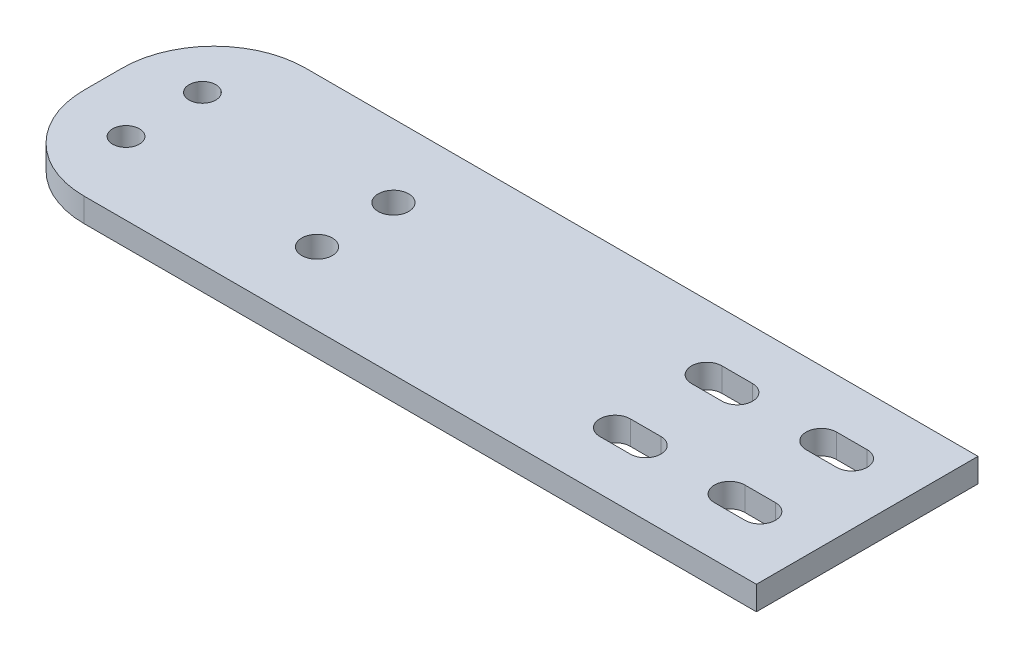
ISO-10303-21;
HEADER;
FILE_DESCRIPTION(('STEP AP214'),'2;1');
FILE_NAME('part.step','',(''),(''),'','','');
FILE_SCHEMA(('AUTOMOTIVE_DESIGN { 1 0 10303 214 1 1 1 1 }'));
ENDSEC;
DATA;
#1=APPLICATION_CONTEXT('core data for automotive mechanical design processes');
#2=APPLICATION_PROTOCOL_DEFINITION('international standard','automotive_design',2000,#1);
#3=PRODUCT_CONTEXT('',#1,'mechanical');
#4=PRODUCT('Part','Part','',(#3));
#5=PRODUCT_RELATED_PRODUCT_CATEGORY('part','',(#4));
#6=PRODUCT_DEFINITION_FORMATION('','',#4);
#7=PRODUCT_DEFINITION_CONTEXT('part definition',#1,'design');
#8=PRODUCT_DEFINITION('design','',#6,#7);
#9=PRODUCT_DEFINITION_SHAPE('','',#8);
#10=(LENGTH_UNIT() NAMED_UNIT(*) SI_UNIT(.MILLI.,.METRE.));
#11=(NAMED_UNIT(*) PLANE_ANGLE_UNIT() SI_UNIT($,.RADIAN.));
#12=(NAMED_UNIT(*) SI_UNIT($,.STERADIAN.) SOLID_ANGLE_UNIT());
#13=UNCERTAINTY_MEASURE_WITH_UNIT(LENGTH_MEASURE(1.E-05),#10,'distance_accuracy_value','');
#14=(GEOMETRIC_REPRESENTATION_CONTEXT(3) GLOBAL_UNCERTAINTY_ASSIGNED_CONTEXT((#13)) GLOBAL_UNIT_ASSIGNED_CONTEXT((#10,
#11,#12)) REPRESENTATION_CONTEXT('',''));
#15=CARTESIAN_POINT('',(0.,0.,0.));
#16=DIRECTION('',(0.,0.,1.));
#17=DIRECTION('',(1.,0.,0.));
#18=AXIS2_PLACEMENT_3D('',#15,#16,#17);
#19=CARTESIAN_POINT('',(0.,6.25,-29.));
#20=DIRECTION('',(1.,0.,0.));
#21=DIRECTION('',(0.,0.,-1.));
#22=AXIS2_PLACEMENT_3D('',#19,#20,#21);
#23=PLANE('',#22);
#24=DIRECTION('',(0.,0.,1.));
#25=VECTOR('',#24,1.);
#26=CARTESIAN_POINT('',(0.,6.25,-29.));
#27=LINE('',#26,#25);
#28=CARTESIAN_POINT('',(0.,6.25,-5.00000000000002));
#29=VERTEX_POINT('',#28);
#30=CARTESIAN_POINT('',(0.,6.25,4.99999999999999));
#31=VERTEX_POINT('',#30);
#32=EDGE_CURVE('E336',#29,#31,#27,.T.);
#33=ORIENTED_EDGE('',*,*,#32,.F.);
#34=DIRECTION('',(0.,-1.,0.));
#35=VECTOR('',#34,1.);
#36=CARTESIAN_POINT('',(0.,6.25,-5.00000000000002));
#37=LINE('',#36,#35);
#38=CARTESIAN_POINT('',(0.,0.,-5.00000000000002));
#39=VERTEX_POINT('',#38);
#40=EDGE_CURVE('E360',#29,#39,#37,.T.);
#41=ORIENTED_EDGE('',*,*,#40,.T.);
#42=DIRECTION('',(0.,0.,1.));
#43=VECTOR('',#42,1.);
#44=CARTESIAN_POINT('',(0.,0.,-29.));
#45=LINE('',#44,#43);
#46=CARTESIAN_POINT('',(0.,0.,4.99999999999999));
#47=VERTEX_POINT('',#46);
#48=EDGE_CURVE('E333',#39,#47,#45,.T.);
#49=ORIENTED_EDGE('',*,*,#48,.T.);
#50=DIRECTION('',(0.,-1.,0.));
#51=VECTOR('',#50,1.);
#52=CARTESIAN_POINT('',(0.,6.25,5.));
#53=LINE('',#52,#51);
#54=EDGE_CURVE('E358',#47,#31,#53,.F.);
#55=ORIENTED_EDGE('',*,*,#54,.T.);
#56=EDGE_LOOP('',(#33,#41,#49,#55));
#57=FACE_BOUND('',#56,.T.);
#58=ADVANCED_FACE('F33',(#57),#23,.F.);
#59=CARTESIAN_POINT('',(0.,6.25,29.));
#60=DIRECTION('',(0.,0.,-1.));
#61=DIRECTION('',(-1.,0.,0.));
#62=AXIS2_PLACEMENT_3D('',#59,#60,#61);
#63=PLANE('',#62);
#64=DIRECTION('',(1.,0.,0.));
#65=VECTOR('',#64,1.);
#66=CARTESIAN_POINT('',(0.,6.25,29.));
#67=LINE('',#66,#65);
#68=CARTESIAN_POINT('',(24.,6.25,29.));
#69=VERTEX_POINT('',#68);
#70=CARTESIAN_POINT('',(200.,6.25,29.));
#71=VERTEX_POINT('',#70);
#72=EDGE_CURVE('E338',#69,#71,#67,.T.);
#73=ORIENTED_EDGE('',*,*,#72,.F.);
#74=DIRECTION('',(0.,-1.,0.));
#75=VECTOR('',#74,1.);
#76=CARTESIAN_POINT('',(24.,6.25,29.));
#77=LINE('',#76,#75);
#78=CARTESIAN_POINT('',(24.,0.,29.));
#79=VERTEX_POINT('',#78);
#80=EDGE_CURVE('E11',#69,#79,#77,.T.);
#81=ORIENTED_EDGE('',*,*,#80,.T.);
#82=DIRECTION('',(1.,0.,0.));
#83=VECTOR('',#82,1.);
#84=CARTESIAN_POINT('',(0.,0.,29.));
#85=LINE('',#84,#83);
#86=CARTESIAN_POINT('',(200.,0.,29.));
#87=VERTEX_POINT('',#86);
#88=EDGE_CURVE('E348',#79,#87,#85,.T.);
#89=ORIENTED_EDGE('',*,*,#88,.T.);
#90=DIRECTION('',(0.,-1.,0.));
#91=VECTOR('',#90,1.);
#92=CARTESIAN_POINT('',(200.,6.25,29.));
#93=LINE('',#92,#91);
#94=EDGE_CURVE('E355',#71,#87,#93,.T.);
#95=ORIENTED_EDGE('',*,*,#94,.F.);
#96=EDGE_LOOP('',(#73,#81,#89,#95));
#97=FACE_BOUND('',#96,.T.);
#98=ADVANCED_FACE('F388',(#97),#63,.F.);
#99=CARTESIAN_POINT('',(200.,6.25,-29.0000000000001));
#100=DIRECTION('',(-1.,0.,0.));
#101=DIRECTION('',(0.,0.,1.));
#102=AXIS2_PLACEMENT_3D('',#99,#100,#101);
#103=PLANE('',#102);
#104=DIRECTION('',(0.,0.,-1.));
#105=VECTOR('',#104,1.);
#106=CARTESIAN_POINT('',(200.,0.,-29.0000000000001));
#107=LINE('',#106,#105);
#108=CARTESIAN_POINT('',(200.,0.,-29.0000000000001));
#109=VERTEX_POINT('',#108);
#110=EDGE_CURVE('E350',#87,#109,#107,.T.);
#111=ORIENTED_EDGE('',*,*,#110,.T.);
#112=DIRECTION('',(0.,-1.,0.));
#113=VECTOR('',#112,1.);
#114=CARTESIAN_POINT('',(200.,6.25,-29.0000000000001));
#115=LINE('',#114,#113);
#116=CARTESIAN_POINT('',(200.,6.25,-29.0000000000001));
#117=VERTEX_POINT('',#116);
#118=EDGE_CURVE('E345',#117,#109,#115,.T.);
#119=ORIENTED_EDGE('',*,*,#118,.F.);
#120=DIRECTION('',(0.,0.,-1.));
#121=VECTOR('',#120,1.);
#122=CARTESIAN_POINT('',(200.,6.25,-29.0000000000001));
#123=LINE('',#122,#121);
#124=EDGE_CURVE('E341',#71,#117,#123,.T.);
#125=ORIENTED_EDGE('',*,*,#124,.F.);
#126=ORIENTED_EDGE('',*,*,#94,.T.);
#127=EDGE_LOOP('',(#111,#119,#125,#126));
#128=FACE_BOUND('',#127,.T.);
#129=ADVANCED_FACE('F384',(#128),#103,.F.);
#130=CARTESIAN_POINT('',(0.,6.25,-29.));
#131=DIRECTION('',(0.,0.,1.));
#132=DIRECTION('',(1.,0.,0.));
#133=AXIS2_PLACEMENT_3D('',#130,#131,#132);
#134=PLANE('',#133);
#135=DIRECTION('',(-1.,0.,0.));
#136=VECTOR('',#135,1.);
#137=CARTESIAN_POINT('',(0.,0.,-29.));
#138=LINE('',#137,#136);
#139=CARTESIAN_POINT('',(24.,0.,-29.));
#140=VERTEX_POINT('',#139);
#141=EDGE_CURVE('E339',#109,#140,#138,.T.);
#142=ORIENTED_EDGE('',*,*,#141,.T.);
#143=DIRECTION('',(0.,-1.,0.));
#144=VECTOR('',#143,1.);
#145=CARTESIAN_POINT('',(24.,6.25,-29.));
#146=LINE('',#145,#144);
#147=CARTESIAN_POINT('',(24.,6.25,-29.));
#148=VERTEX_POINT('',#147);
#149=EDGE_CURVE('E56',#140,#148,#146,.F.);
#150=ORIENTED_EDGE('',*,*,#149,.T.);
#151=DIRECTION('',(-1.,0.,0.));
#152=VECTOR('',#151,1.);
#153=CARTESIAN_POINT('',(0.,6.25,-29.));
#154=LINE('',#153,#152);
#155=EDGE_CURVE('E343',#117,#148,#154,.T.);
#156=ORIENTED_EDGE('',*,*,#155,.F.);
#157=ORIENTED_EDGE('',*,*,#118,.T.);
#158=EDGE_LOOP('',(#142,#150,#156,#157));
#159=FACE_BOUND('',#158,.T.);
#160=ADVANCED_FACE('F380',(#159),#134,.F.);
#161=CARTESIAN_POINT('',(0.,6.25,0.));
#162=DIRECTION('',(0.,1.,0.));
#163=DIRECTION('',(0.,0.,1.));
#164=AXIS2_PLACEMENT_3D('',#161,#162,#163);
#165=PLANE('',#164);
#166=CARTESIAN_POINT('',(66.,6.25,10.));
#167=DIRECTION('',(0.,1.,0.));
#168=DIRECTION('',(0.,0.,1.));
#169=AXIS2_PLACEMENT_3D('',#166,#167,#168);
#170=CIRCLE('',#169,4.00000000000001);
#171=CARTESIAN_POINT('',(66.,6.25,14.));
#172=VERTEX_POINT('',#171);
#173=EDGE_CURVE('E220',#172,#172,#170,.F.);
#174=ORIENTED_EDGE('',*,*,#173,.T.);
#175=EDGE_LOOP('',(#174));
#176=FACE_BOUND('',#175,.T.);
#177=CARTESIAN_POINT('',(66.,6.25,-10.));
#178=DIRECTION('',(0.,1.,0.));
#179=DIRECTION('',(0.,0.,1.));
#180=AXIS2_PLACEMENT_3D('',#177,#178,#179);
#181=CIRCLE('',#180,4.00000000000001);
#182=CARTESIAN_POINT('',(66.,6.25,-5.99999999999999));
#183=VERTEX_POINT('',#182);
#184=EDGE_CURVE('E495',#183,#183,#181,.F.);
#185=ORIENTED_EDGE('',*,*,#184,.T.);
#186=EDGE_LOOP('',(#185));
#187=FACE_BOUND('',#186,.T.);
#188=DIRECTION('',(1.,0.,0.));
#189=VECTOR('',#188,1.);
#190=CARTESIAN_POINT('',(146.,6.25,16.0000000000006));
#191=LINE('',#190,#189);
#192=CARTESIAN_POINT('',(146.,6.25,16.0000000000006));
#193=VERTEX_POINT('',#192);
#194=CARTESIAN_POINT('',(154.,6.25,15.9999999999983));
#195=VERTEX_POINT('',#194);
#196=EDGE_CURVE('E266',#193,#195,#191,.T.);
#197=ORIENTED_EDGE('',*,*,#196,.F.);
#198=CARTESIAN_POINT('',(146.,6.25,11.9999999999978));
#199=DIRECTION('',(0.,1.,0.));
#200=DIRECTION('',(0.,0.,1.));
#201=AXIS2_PLACEMENT_3D('',#198,#199,#200);
#202=CIRCLE('',#201,4.00000000000142);
#203=CARTESIAN_POINT('',(146.,6.25,7.99999999999778));
#204=VERTEX_POINT('',#203);
#205=EDGE_CURVE('E264',#204,#193,#202,.T.);
#206=ORIENTED_EDGE('',*,*,#205,.F.);
#207=DIRECTION('',(-1.,0.,-2.00143721040848E-13));
#208=VECTOR('',#207,1.);
#209=CARTESIAN_POINT('',(146.,6.25,7.99999999999778));
#210=LINE('',#209,#208);
#211=CARTESIAN_POINT('',(153.999999999999,6.25,7.99999999999938));
#212=VERTEX_POINT('',#211);
#213=EDGE_CURVE('E272',#212,#204,#210,.T.);
#214=ORIENTED_EDGE('',*,*,#213,.F.);
#215=CARTESIAN_POINT('',(154.,6.25,11.9999999999977));
#216=DIRECTION('',(0.,1.,0.));
#217=DIRECTION('',(0.,0.,1.));
#218=AXIS2_PLACEMENT_3D('',#215,#216,#217);
#219=CIRCLE('',#218,4.00000000000061);
#220=EDGE_CURVE('E269',#195,#212,#219,.T.);
#221=ORIENTED_EDGE('',*,*,#220,.F.);
#222=EDGE_LOOP('',(#197,#206,#214,#221));
#223=FACE_BOUND('',#222,.T.);
#224=DIRECTION('',(1.,0.,0.));
#225=VECTOR('',#224,1.);
#226=CARTESIAN_POINT('',(146.,6.25,-7.99999999999979));
#227=LINE('',#226,#225);
#228=CARTESIAN_POINT('',(146.,6.25,-7.99999999999979));
#229=VERTEX_POINT('',#228);
#230=CARTESIAN_POINT('',(154.,6.25,-8.00000000000074));
#231=VERTEX_POINT('',#230);
#232=EDGE_CURVE('E233',#229,#231,#227,.T.);
#233=ORIENTED_EDGE('',*,*,#232,.F.);
#234=CARTESIAN_POINT('',(146.,6.25,-12.0000000000022));
#235=DIRECTION('',(0.,1.,0.));
#236=DIRECTION('',(0.,0.,1.));
#237=AXIS2_PLACEMENT_3D('',#234,#235,#236);
#238=CIRCLE('',#237,4.00000000000151);
#239=CARTESIAN_POINT('',(146.,6.25,-16.0000000000028));
#240=VERTEX_POINT('',#239);
#241=EDGE_CURVE('E231',#240,#229,#238,.T.);
#242=ORIENTED_EDGE('',*,*,#241,.F.);
#243=DIRECTION('',(-1.,0.,0.));
#244=VECTOR('',#243,1.);
#245=CARTESIAN_POINT('',(146.,6.25,-16.0000000000028));
#246=LINE('',#245,#244);
#247=CARTESIAN_POINT('',(154.,6.25,-16.0000000000029));
#248=VERTEX_POINT('',#247);
#249=EDGE_CURVE('E239',#248,#240,#246,.T.);
#250=ORIENTED_EDGE('',*,*,#249,.F.);
#251=CARTESIAN_POINT('',(154.,6.25,-12.0000000000023));
#252=DIRECTION('',(0.,1.,0.));
#253=DIRECTION('',(0.,0.,1.));
#254=AXIS2_PLACEMENT_3D('',#251,#252,#253);
#255=CIRCLE('',#254,4.00000000000154);
#256=EDGE_CURVE('E236',#231,#248,#255,.T.);
#257=ORIENTED_EDGE('',*,*,#256,.F.);
#258=EDGE_LOOP('',(#233,#242,#250,#257));
#259=FACE_BOUND('',#258,.T.);
#260=DIRECTION('',(1.,0.,0.));
#261=VECTOR('',#260,1.);
#262=CARTESIAN_POINT('',(176.,6.25,-8.));
#263=LINE('',#262,#261);
#264=CARTESIAN_POINT('',(176.,6.25,-8.));
#265=VERTEX_POINT('',#264);
#266=CARTESIAN_POINT('',(184.,6.25,-8.00000000000156));
#267=VERTEX_POINT('',#266);
#268=EDGE_CURVE('E303',#265,#267,#263,.T.);
#269=ORIENTED_EDGE('',*,*,#268,.F.);
#270=CARTESIAN_POINT('',(176.,6.25,-12.0000000000018));
#271=DIRECTION('',(0.,1.,0.));
#272=DIRECTION('',(0.,0.,1.));
#273=AXIS2_PLACEMENT_3D('',#270,#271,#272);
#274=CIRCLE('',#273,4.00000000000093);
#275=CARTESIAN_POINT('',(176.,6.25,-16.0000000000019));
#276=VERTEX_POINT('',#275);
#277=EDGE_CURVE('E301',#276,#265,#274,.T.);
#278=ORIENTED_EDGE('',*,*,#277,.F.);
#279=DIRECTION('',(-1.,0.,0.));
#280=VECTOR('',#279,1.);
#281=CARTESIAN_POINT('',(176.,6.25,-16.0000000000019));
#282=LINE('',#281,#280);
#283=CARTESIAN_POINT('',(184.,6.25,-16.0000000000019));
#284=VERTEX_POINT('',#283);
#285=EDGE_CURVE('E309',#284,#276,#282,.T.);
#286=ORIENTED_EDGE('',*,*,#285,.F.);
#287=CARTESIAN_POINT('',(184.,6.25,-12.0000000000025));
#288=DIRECTION('',(0.,1.,0.));
#289=DIRECTION('',(0.,0.,1.));
#290=AXIS2_PLACEMENT_3D('',#287,#288,#289);
#291=CIRCLE('',#290,4.00000000000093);
#292=EDGE_CURVE('E306',#267,#284,#291,.T.);
#293=ORIENTED_EDGE('',*,*,#292,.F.);
#294=EDGE_LOOP('',(#269,#278,#286,#293));
#295=FACE_BOUND('',#294,.T.);
#296=CARTESIAN_POINT('',(16.,6.25,9.99999999999989));
#297=DIRECTION('',(0.,1.,0.));
#298=DIRECTION('',(0.,0.,1.));
#299=AXIS2_PLACEMENT_3D('',#296,#297,#298);
#300=CIRCLE('',#299,3.49999999999997);
#301=CARTESIAN_POINT('',(16.,6.25,13.4999999999999));
#302=VERTEX_POINT('',#301);
#303=EDGE_CURVE('E293',#302,#302,#300,.T.);
#304=ORIENTED_EDGE('',*,*,#303,.F.);
#305=EDGE_LOOP('',(#304));
#306=FACE_BOUND('',#305,.T.);
#307=DIRECTION('',(1.,0.,0.));
#308=VECTOR('',#307,1.);
#309=CARTESIAN_POINT('',(176.,6.25,16.));
#310=LINE('',#309,#308);
#311=CARTESIAN_POINT('',(176.,6.25,16.));
#312=VERTEX_POINT('',#311);
#313=CARTESIAN_POINT('',(184.,6.25,15.9999999999988));
#314=VERTEX_POINT('',#313);
#315=EDGE_CURVE('E196',#312,#314,#310,.T.);
#316=ORIENTED_EDGE('',*,*,#315,.F.);
#317=CARTESIAN_POINT('',(176.,6.25,11.9999999999976));
#318=DIRECTION('',(0.,1.,0.));
#319=DIRECTION('',(0.,0.,1.));
#320=AXIS2_PLACEMENT_3D('',#317,#318,#319);
#321=CIRCLE('',#320,4.00000000000031);
#322=CARTESIAN_POINT('',(176.,6.25,7.99999999999938));
#323=VERTEX_POINT('',#322);
#324=EDGE_CURVE('E186',#323,#312,#321,.T.);
#325=ORIENTED_EDGE('',*,*,#324,.F.);
#326=DIRECTION('',(-1.,0.,2.33753988387862E-13));
#327=VECTOR('',#326,1.);
#328=CARTESIAN_POINT('',(176.,6.25,7.99999999999938));
#329=LINE('',#328,#327);
#330=CARTESIAN_POINT('',(184.,6.25,7.99999999999751));
#331=VERTEX_POINT('',#330);
#332=EDGE_CURVE('E213',#331,#323,#329,.T.);
#333=ORIENTED_EDGE('',*,*,#332,.F.);
#334=CARTESIAN_POINT('',(184.,6.25,11.9999999999975));
#335=DIRECTION('',(0.,1.,0.));
#336=DIRECTION('',(0.,0.,1.));
#337=AXIS2_PLACEMENT_3D('',#334,#335,#336);
#338=CIRCLE('',#337,4.00000000000124);
#339=EDGE_CURVE('E211',#314,#331,#338,.T.);
#340=ORIENTED_EDGE('',*,*,#339,.F.);
#341=EDGE_LOOP('',(#316,#325,#333,#340));
#342=FACE_BOUND('',#341,.T.);
#343=CARTESIAN_POINT('',(16.,6.25,-10.0000000000001));
#344=DIRECTION('',(0.,1.,0.));
#345=DIRECTION('',(0.,0.,1.));
#346=AXIS2_PLACEMENT_3D('',#343,#344,#345);
#347=CIRCLE('',#346,3.49999999999996);
#348=CARTESIAN_POINT('',(16.,6.25,-6.50000000000015));
#349=VERTEX_POINT('',#348);
#350=EDGE_CURVE('E330',#349,#349,#347,.T.);
#351=ORIENTED_EDGE('',*,*,#350,.F.);
#352=EDGE_LOOP('',(#351));
#353=FACE_BOUND('',#352,.T.);
#354=ORIENTED_EDGE('',*,*,#155,.T.);
#355=CARTESIAN_POINT('',(24.,6.25,-5.00000000000003));
#356=DIRECTION('',(0.,1.,0.));
#357=DIRECTION('',(0.,0.,1.));
#358=AXIS2_PLACEMENT_3D('',#355,#356,#357);
#359=CIRCLE('',#358,24.);
#360=EDGE_CURVE('E41',#148,#29,#359,.T.);
#361=ORIENTED_EDGE('',*,*,#360,.T.);
#362=ORIENTED_EDGE('',*,*,#32,.T.);
#363=CARTESIAN_POINT('',(24.,6.25,5.));
#364=DIRECTION('',(0.,1.,0.));
#365=DIRECTION('',(0.,0.,1.));
#366=AXIS2_PLACEMENT_3D('',#363,#364,#365);
#367=CIRCLE('',#366,24.);
#368=EDGE_CURVE('E48',#31,#69,#367,.T.);
#369=ORIENTED_EDGE('',*,*,#368,.T.);
#370=ORIENTED_EDGE('',*,*,#72,.T.);
#371=ORIENTED_EDGE('',*,*,#124,.T.);
#372=EDGE_LOOP('',(#354,#361,#362,#369,#370,#371));
#373=FACE_BOUND('',#372,.T.);
#374=ADVANCED_FACE('F208',(#176,#187,#223,#259,#295,#306,#342,#353,#373),#165,.T.);
#375=CARTESIAN_POINT('',(0.,0.,0.));
#376=DIRECTION('',(0.,1.,0.));
#377=DIRECTION('',(0.,0.,1.));
#378=AXIS2_PLACEMENT_3D('',#375,#376,#377);
#379=PLANE('',#378);
#380=CARTESIAN_POINT('',(66.,0.,10.));
#381=DIRECTION('',(0.,1.,0.));
#382=DIRECTION('',(0.,0.,1.));
#383=AXIS2_PLACEMENT_3D('',#380,#381,#382);
#384=CIRCLE('',#383,4.00000000000001);
#385=CARTESIAN_POINT('',(66.,0.,14.));
#386=VERTEX_POINT('',#385);
#387=EDGE_CURVE('E494',#386,#386,#384,.T.);
#388=ORIENTED_EDGE('',*,*,#387,.T.);
#389=EDGE_LOOP('',(#388));
#390=FACE_BOUND('',#389,.T.);
#391=CARTESIAN_POINT('',(66.,0.,-10.));
#392=DIRECTION('',(0.,1.,0.));
#393=DIRECTION('',(0.,0.,1.));
#394=AXIS2_PLACEMENT_3D('',#391,#392,#393);
#395=CIRCLE('',#394,4.00000000000001);
#396=CARTESIAN_POINT('',(66.,0.,-5.99999999999999));
#397=VERTEX_POINT('',#396);
#398=EDGE_CURVE('E496',#397,#397,#395,.T.);
#399=ORIENTED_EDGE('',*,*,#398,.T.);
#400=EDGE_LOOP('',(#399));
#401=FACE_BOUND('',#400,.T.);
#402=CARTESIAN_POINT('',(146.,0.,11.9999999999978));
#403=DIRECTION('',(0.,1.,0.));
#404=DIRECTION('',(0.,0.,1.));
#405=AXIS2_PLACEMENT_3D('',#402,#403,#404);
#406=CIRCLE('',#405,4.00000000000142);
#407=CARTESIAN_POINT('',(146.,0.,7.99999999999778));
#408=VERTEX_POINT('',#407);
#409=CARTESIAN_POINT('',(146.,0.,16.0000000000006));
#410=VERTEX_POINT('',#409);
#411=EDGE_CURVE('E204',#408,#410,#406,.T.);
#412=ORIENTED_EDGE('',*,*,#411,.T.);
#413=DIRECTION('',(1.,0.,0.));
#414=VECTOR('',#413,1.);
#415=CARTESIAN_POINT('',(146.,0.,16.0000000000006));
#416=LINE('',#415,#414);
#417=CARTESIAN_POINT('',(154.,0.,15.9999999999983));
#418=VERTEX_POINT('',#417);
#419=EDGE_CURVE('E277',#410,#418,#416,.T.);
#420=ORIENTED_EDGE('',*,*,#419,.T.);
#421=CARTESIAN_POINT('',(154.,0.,11.9999999999977));
#422=DIRECTION('',(0.,1.,0.));
#423=DIRECTION('',(0.,0.,1.));
#424=AXIS2_PLACEMENT_3D('',#421,#422,#423);
#425=CIRCLE('',#424,4.00000000000061);
#426=CARTESIAN_POINT('',(153.999999999999,0.,7.99999999999938));
#427=VERTEX_POINT('',#426);
#428=EDGE_CURVE('E280',#418,#427,#425,.T.);
#429=ORIENTED_EDGE('',*,*,#428,.T.);
#430=DIRECTION('',(-1.,0.,-2.00143721040848E-13));
#431=VECTOR('',#430,1.);
#432=CARTESIAN_POINT('',(146.,0.,7.99999999999778));
#433=LINE('',#432,#431);
#434=EDGE_CURVE('E267',#427,#408,#433,.T.);
#435=ORIENTED_EDGE('',*,*,#434,.T.);
#436=EDGE_LOOP('',(#412,#420,#429,#435));
#437=FACE_BOUND('',#436,.T.);
#438=CARTESIAN_POINT('',(146.,0.,-12.0000000000022));
#439=DIRECTION('',(0.,1.,0.));
#440=DIRECTION('',(0.,0.,1.));
#441=AXIS2_PLACEMENT_3D('',#438,#439,#440);
#442=CIRCLE('',#441,4.00000000000151);
#443=CARTESIAN_POINT('',(146.,0.,-16.0000000000028));
#444=VERTEX_POINT('',#443);
#445=CARTESIAN_POINT('',(146.,0.,-7.99999999999979));
#446=VERTEX_POINT('',#445);
#447=EDGE_CURVE('E242',#444,#446,#442,.T.);
#448=ORIENTED_EDGE('',*,*,#447,.T.);
#449=DIRECTION('',(1.,0.,0.));
#450=VECTOR('',#449,1.);
#451=CARTESIAN_POINT('',(146.,0.,-7.99999999999979));
#452=LINE('',#451,#450);
#453=CARTESIAN_POINT('',(154.,0.,-8.00000000000074));
#454=VERTEX_POINT('',#453);
#455=EDGE_CURVE('E245',#446,#454,#452,.T.);
#456=ORIENTED_EDGE('',*,*,#455,.T.);
#457=CARTESIAN_POINT('',(154.,0.,-12.0000000000023));
#458=DIRECTION('',(0.,1.,0.));
#459=DIRECTION('',(0.,0.,1.));
#460=AXIS2_PLACEMENT_3D('',#457,#458,#459);
#461=CIRCLE('',#460,4.00000000000154);
#462=CARTESIAN_POINT('',(154.,0.,-16.0000000000029));
#463=VERTEX_POINT('',#462);
#464=EDGE_CURVE('E249',#454,#463,#461,.T.);
#465=ORIENTED_EDGE('',*,*,#464,.T.);
#466=DIRECTION('',(-1.,0.,0.));
#467=VECTOR('',#466,1.);
#468=CARTESIAN_POINT('',(146.,0.,-16.0000000000028));
#469=LINE('',#468,#467);
#470=EDGE_CURVE('E234',#463,#444,#469,.T.);
#471=ORIENTED_EDGE('',*,*,#470,.T.);
#472=EDGE_LOOP('',(#448,#456,#465,#471));
#473=FACE_BOUND('',#472,.T.);
#474=CARTESIAN_POINT('',(176.,0.,-12.0000000000018));
#475=DIRECTION('',(0.,1.,0.));
#476=DIRECTION('',(0.,0.,1.));
#477=AXIS2_PLACEMENT_3D('',#474,#475,#476);
#478=CIRCLE('',#477,4.00000000000093);
#479=CARTESIAN_POINT('',(176.,0.,-16.0000000000019));
#480=VERTEX_POINT('',#479);
#481=CARTESIAN_POINT('',(176.,0.,-8.));
#482=VERTEX_POINT('',#481);
#483=EDGE_CURVE('E263',#480,#482,#478,.T.);
#484=ORIENTED_EDGE('',*,*,#483,.T.);
#485=DIRECTION('',(1.,0.,0.));
#486=VECTOR('',#485,1.);
#487=CARTESIAN_POINT('',(176.,0.,-8.));
#488=LINE('',#487,#486);
#489=CARTESIAN_POINT('',(184.,0.,-8.00000000000156));
#490=VERTEX_POINT('',#489);
#491=EDGE_CURVE('E314',#482,#490,#488,.T.);
#492=ORIENTED_EDGE('',*,*,#491,.T.);
#493=CARTESIAN_POINT('',(184.,0.,-12.0000000000025));
#494=DIRECTION('',(0.,1.,0.));
#495=DIRECTION('',(0.,0.,1.));
#496=AXIS2_PLACEMENT_3D('',#493,#494,#495);
#497=CIRCLE('',#496,4.00000000000093);
#498=CARTESIAN_POINT('',(184.,0.,-16.0000000000019));
#499=VERTEX_POINT('',#498);
#500=EDGE_CURVE('E317',#490,#499,#497,.T.);
#501=ORIENTED_EDGE('',*,*,#500,.T.);
#502=DIRECTION('',(-1.,0.,0.));
#503=VECTOR('',#502,1.);
#504=CARTESIAN_POINT('',(176.,0.,-16.0000000000019));
#505=LINE('',#504,#503);
#506=EDGE_CURVE('E304',#499,#480,#505,.T.);
#507=ORIENTED_EDGE('',*,*,#506,.T.);
#508=EDGE_LOOP('',(#484,#492,#501,#507));
#509=FACE_BOUND('',#508,.T.);
#510=CARTESIAN_POINT('',(16.,0.,9.99999999999989));
#511=DIRECTION('',(0.,1.,0.));
#512=DIRECTION('',(0.,0.,1.));
#513=AXIS2_PLACEMENT_3D('',#510,#511,#512);
#514=CIRCLE('',#513,3.49999999999997);
#515=CARTESIAN_POINT('',(16.,0.,13.4999999999999));
#516=VERTEX_POINT('',#515);
#517=EDGE_CURVE('E297',#516,#516,#514,.T.);
#518=ORIENTED_EDGE('',*,*,#517,.T.);
#519=EDGE_LOOP('',(#518));
#520=FACE_BOUND('',#519,.T.);
#521=CARTESIAN_POINT('',(176.,0.,11.9999999999976));
#522=DIRECTION('',(0.,1.,0.));
#523=DIRECTION('',(0.,0.,1.));
#524=AXIS2_PLACEMENT_3D('',#521,#522,#523);
#525=CIRCLE('',#524,4.00000000000031);
#526=CARTESIAN_POINT('',(176.,0.,7.99999999999938));
#527=VERTEX_POINT('',#526);
#528=CARTESIAN_POINT('',(176.,0.,16.));
#529=VERTEX_POINT('',#528);
#530=EDGE_CURVE('E218',#527,#529,#525,.T.);
#531=ORIENTED_EDGE('',*,*,#530,.T.);
#532=DIRECTION('',(1.,0.,0.));
#533=VECTOR('',#532,1.);
#534=CARTESIAN_POINT('',(176.,0.,16.));
#535=LINE('',#534,#533);
#536=CARTESIAN_POINT('',(184.,0.,15.9999999999988));
#537=VERTEX_POINT('',#536);
#538=EDGE_CURVE('E203',#529,#537,#535,.T.);
#539=ORIENTED_EDGE('',*,*,#538,.T.);
#540=CARTESIAN_POINT('',(184.,0.,11.9999999999975));
#541=DIRECTION('',(0.,1.,0.));
#542=DIRECTION('',(0.,0.,1.));
#543=AXIS2_PLACEMENT_3D('',#540,#541,#542);
#544=CIRCLE('',#543,4.00000000000124);
#545=CARTESIAN_POINT('',(184.,0.,7.99999999999751));
#546=VERTEX_POINT('',#545);
#547=EDGE_CURVE('E222',#537,#546,#544,.T.);
#548=ORIENTED_EDGE('',*,*,#547,.T.);
#549=DIRECTION('',(-1.,0.,2.33753988387862E-13));
#550=VECTOR('',#549,1.);
#551=CARTESIAN_POINT('',(176.,0.,7.99999999999938));
#552=LINE('',#551,#550);
#553=EDGE_CURVE('E197',#546,#527,#552,.T.);
#554=ORIENTED_EDGE('',*,*,#553,.T.);
#555=EDGE_LOOP('',(#531,#539,#548,#554));
#556=FACE_BOUND('',#555,.T.);
#557=CARTESIAN_POINT('',(16.,0.,-10.0000000000001));
#558=DIRECTION('',(0.,1.,0.));
#559=DIRECTION('',(0.,0.,1.));
#560=AXIS2_PLACEMENT_3D('',#557,#558,#559);
#561=CIRCLE('',#560,3.49999999999996);
#562=CARTESIAN_POINT('',(16.,0.,-6.50000000000015));
#563=VERTEX_POINT('',#562);
#564=EDGE_CURVE('E296',#563,#563,#561,.T.);
#565=ORIENTED_EDGE('',*,*,#564,.T.);
#566=EDGE_LOOP('',(#565));
#567=FACE_BOUND('',#566,.T.);
#568=ORIENTED_EDGE('',*,*,#48,.F.);
#569=CARTESIAN_POINT('',(24.,0.,-5.00000000000003));
#570=DIRECTION('',(0.,1.,0.));
#571=DIRECTION('',(0.,0.,1.));
#572=AXIS2_PLACEMENT_3D('',#569,#570,#571);
#573=CIRCLE('',#572,24.);
#574=EDGE_CURVE('E365',#39,#140,#573,.F.);
#575=ORIENTED_EDGE('',*,*,#574,.T.);
#576=ORIENTED_EDGE('',*,*,#141,.F.);
#577=ORIENTED_EDGE('',*,*,#110,.F.);
#578=ORIENTED_EDGE('',*,*,#88,.F.);
#579=CARTESIAN_POINT('',(24.,0.,5.));
#580=DIRECTION('',(0.,1.,0.));
#581=DIRECTION('',(0.,0.,1.));
#582=AXIS2_PLACEMENT_3D('',#579,#580,#581);
#583=CIRCLE('',#582,24.);
#584=EDGE_CURVE('E363',#79,#47,#583,.F.);
#585=ORIENTED_EDGE('',*,*,#584,.T.);
#586=EDGE_LOOP('',(#568,#575,#576,#577,#578,#585));
#587=FACE_BOUND('',#586,.T.);
#588=ADVANCED_FACE('F378',(#390,#401,#437,#473,#509,#520,#556,#567,#587),#379,.F.);
#589=CARTESIAN_POINT('',(16.,6.25,-10.0000000000001));
#590=DIRECTION('',(0.,-1.,0.));
#591=DIRECTION('',(0.,0.,-1.));
#592=AXIS2_PLACEMENT_3D('',#589,#590,#591);
#593=CYLINDRICAL_SURFACE('',#592,3.49999999999996);
#594=ORIENTED_EDGE('',*,*,#350,.T.);
#595=EDGE_LOOP('',(#594));
#596=FACE_BOUND('',#595,.T.);
#597=ORIENTED_EDGE('',*,*,#564,.F.);
#598=EDGE_LOOP('',(#597));
#599=FACE_BOUND('',#598,.T.);
#600=ADVANCED_FACE('F414',(#596,#599),#593,.F.);
#601=CARTESIAN_POINT('',(176.,6.25,11.9999999999976));
#602=DIRECTION('',(0.,-1.,0.));
#603=DIRECTION('',(0.,0.,-1.));
#604=AXIS2_PLACEMENT_3D('',#601,#602,#603);
#605=CYLINDRICAL_SURFACE('',#604,4.00000000000031);
#606=ORIENTED_EDGE('',*,*,#530,.F.);
#607=DIRECTION('',(0.,-1.,0.));
#608=VECTOR('',#607,1.);
#609=CARTESIAN_POINT('',(176.,6.25,7.99999999999938));
#610=LINE('',#609,#608);
#611=EDGE_CURVE('E192',#323,#527,#610,.T.);
#612=ORIENTED_EDGE('',*,*,#611,.F.);
#613=ORIENTED_EDGE('',*,*,#324,.T.);
#614=DIRECTION('',(0.,-1.,0.));
#615=VECTOR('',#614,1.);
#616=CARTESIAN_POINT('',(176.,6.25,16.));
#617=LINE('',#616,#615);
#618=EDGE_CURVE('E189',#312,#529,#617,.T.);
#619=ORIENTED_EDGE('',*,*,#618,.T.);
#620=EDGE_LOOP('',(#606,#612,#613,#619));
#621=FACE_BOUND('',#620,.T.);
#622=ADVANCED_FACE('F188',(#621),#605,.F.);
#623=CARTESIAN_POINT('',(176.,6.25,16.));
#624=DIRECTION('',(0.,0.,-1.));
#625=DIRECTION('',(-1.,0.,0.));
#626=AXIS2_PLACEMENT_3D('',#623,#624,#625);
#627=PLANE('',#626);
#628=ORIENTED_EDGE('',*,*,#538,.F.);
#629=ORIENTED_EDGE('',*,*,#618,.F.);
#630=ORIENTED_EDGE('',*,*,#315,.T.);
#631=DIRECTION('',(0.,-1.,0.));
#632=VECTOR('',#631,1.);
#633=CARTESIAN_POINT('',(184.,6.25,15.9999999999988));
#634=LINE('',#633,#632);
#635=EDGE_CURVE('E205',#314,#537,#634,.T.);
#636=ORIENTED_EDGE('',*,*,#635,.T.);
#637=EDGE_LOOP('',(#628,#629,#630,#636));
#638=FACE_BOUND('',#637,.T.);
#639=ADVANCED_FACE('F200',(#638),#627,.T.);
#640=CARTESIAN_POINT('',(184.,6.25,11.9999999999975));
#641=DIRECTION('',(0.,-1.,0.));
#642=DIRECTION('',(0.,0.,-1.));
#643=AXIS2_PLACEMENT_3D('',#640,#641,#642);
#644=CYLINDRICAL_SURFACE('',#643,4.00000000000124);
#645=ORIENTED_EDGE('',*,*,#547,.F.);
#646=ORIENTED_EDGE('',*,*,#635,.F.);
#647=ORIENTED_EDGE('',*,*,#339,.T.);
#648=DIRECTION('',(0.,-1.,0.));
#649=VECTOR('',#648,1.);
#650=CARTESIAN_POINT('',(184.,6.25,7.99999999999751));
#651=LINE('',#650,#649);
#652=EDGE_CURVE('E228',#331,#546,#651,.T.);
#653=ORIENTED_EDGE('',*,*,#652,.T.);
#654=EDGE_LOOP('',(#645,#646,#647,#653));
#655=FACE_BOUND('',#654,.T.);
#656=ADVANCED_FACE('F478',(#655),#644,.F.);
#657=CARTESIAN_POINT('',(176.,6.25,7.99999999999938));
#658=DIRECTION('',(2.33753988387862E-13,0.,1.));
#659=DIRECTION('',(1.,0.,-2.33753988387862E-13));
#660=AXIS2_PLACEMENT_3D('',#657,#658,#659);
#661=PLANE('',#660);
#662=ORIENTED_EDGE('',*,*,#553,.F.);
#663=ORIENTED_EDGE('',*,*,#652,.F.);
#664=ORIENTED_EDGE('',*,*,#332,.T.);
#665=ORIENTED_EDGE('',*,*,#611,.T.);
#666=EDGE_LOOP('',(#662,#663,#664,#665));
#667=FACE_BOUND('',#666,.T.);
#668=ADVANCED_FACE('F442',(#667),#661,.T.);
#669=CARTESIAN_POINT('',(16.,6.25,9.99999999999989));
#670=DIRECTION('',(0.,-1.,0.));
#671=DIRECTION('',(0.,0.,-1.));
#672=AXIS2_PLACEMENT_3D('',#669,#670,#671);
#673=CYLINDRICAL_SURFACE('',#672,3.49999999999997);
#674=ORIENTED_EDGE('',*,*,#303,.T.);
#675=EDGE_LOOP('',(#674));
#676=FACE_BOUND('',#675,.T.);
#677=ORIENTED_EDGE('',*,*,#517,.F.);
#678=EDGE_LOOP('',(#677));
#679=FACE_BOUND('',#678,.T.);
#680=ADVANCED_FACE('F426',(#676,#679),#673,.F.);
#681=CARTESIAN_POINT('',(176.,6.25,-12.0000000000018));
#682=DIRECTION('',(0.,-1.,0.));
#683=DIRECTION('',(0.,0.,-1.));
#684=AXIS2_PLACEMENT_3D('',#681,#682,#683);
#685=CYLINDRICAL_SURFACE('',#684,4.00000000000093);
#686=ORIENTED_EDGE('',*,*,#483,.F.);
#687=DIRECTION('',(0.,-1.,0.));
#688=VECTOR('',#687,1.);
#689=CARTESIAN_POINT('',(176.,6.25,-16.0000000000019));
#690=LINE('',#689,#688);
#691=EDGE_CURVE('E311',#276,#480,#690,.T.);
#692=ORIENTED_EDGE('',*,*,#691,.F.);
#693=ORIENTED_EDGE('',*,*,#277,.T.);
#694=DIRECTION('',(0.,-1.,0.));
#695=VECTOR('',#694,1.);
#696=CARTESIAN_POINT('',(176.,6.25,-8.));
#697=LINE('',#696,#695);
#698=EDGE_CURVE('E300',#265,#482,#697,.T.);
#699=ORIENTED_EDGE('',*,*,#698,.T.);
#700=EDGE_LOOP('',(#686,#692,#693,#699));
#701=FACE_BOUND('',#700,.T.);
#702=ADVANCED_FACE('F422',(#701),#685,.F.);
#703=CARTESIAN_POINT('',(176.,6.25,-8.));
#704=DIRECTION('',(0.,0.,-1.));
#705=DIRECTION('',(-1.,0.,0.));
#706=AXIS2_PLACEMENT_3D('',#703,#704,#705);
#707=PLANE('',#706);
#708=ORIENTED_EDGE('',*,*,#491,.F.);
#709=ORIENTED_EDGE('',*,*,#698,.F.);
#710=ORIENTED_EDGE('',*,*,#268,.T.);
#711=DIRECTION('',(0.,-1.,0.));
#712=VECTOR('',#711,1.);
#713=CARTESIAN_POINT('',(184.,6.25,-8.00000000000156));
#714=LINE('',#713,#712);
#715=EDGE_CURVE('E326',#267,#490,#714,.T.);
#716=ORIENTED_EDGE('',*,*,#715,.T.);
#717=EDGE_LOOP('',(#708,#709,#710,#716));
#718=FACE_BOUND('',#717,.T.);
#719=ADVANCED_FACE('F425',(#718),#707,.T.);
#720=CARTESIAN_POINT('',(184.,6.25,-12.0000000000025));
#721=DIRECTION('',(0.,-1.,0.));
#722=DIRECTION('',(0.,0.,-1.));
#723=AXIS2_PLACEMENT_3D('',#720,#721,#722);
#724=CYLINDRICAL_SURFACE('',#723,4.00000000000093);
#725=ORIENTED_EDGE('',*,*,#500,.F.);
#726=ORIENTED_EDGE('',*,*,#715,.F.);
#727=ORIENTED_EDGE('',*,*,#292,.T.);
#728=DIRECTION('',(0.,-1.,0.));
#729=VECTOR('',#728,1.);
#730=CARTESIAN_POINT('',(184.,6.25,-16.0000000000019));
#731=LINE('',#730,#729);
#732=EDGE_CURVE('E324',#284,#499,#731,.T.);
#733=ORIENTED_EDGE('',*,*,#732,.T.);
#734=EDGE_LOOP('',(#725,#726,#727,#733));
#735=FACE_BOUND('',#734,.T.);
#736=ADVANCED_FACE('F430',(#735),#724,.F.);
#737=CARTESIAN_POINT('',(176.,6.25,-16.0000000000019));
#738=DIRECTION('',(0.,0.,1.));
#739=DIRECTION('',(1.,0.,0.));
#740=AXIS2_PLACEMENT_3D('',#737,#738,#739);
#741=PLANE('',#740);
#742=ORIENTED_EDGE('',*,*,#506,.F.);
#743=ORIENTED_EDGE('',*,*,#732,.F.);
#744=ORIENTED_EDGE('',*,*,#285,.T.);
#745=ORIENTED_EDGE('',*,*,#691,.T.);
#746=EDGE_LOOP('',(#742,#743,#744,#745));
#747=FACE_BOUND('',#746,.T.);
#748=ADVANCED_FACE('F434',(#747),#741,.T.);
#749=CARTESIAN_POINT('',(146.,6.25,-12.0000000000022));
#750=DIRECTION('',(0.,-1.,0.));
#751=DIRECTION('',(0.,0.,-1.));
#752=AXIS2_PLACEMENT_3D('',#749,#750,#751);
#753=CYLINDRICAL_SURFACE('',#752,4.00000000000151);
#754=ORIENTED_EDGE('',*,*,#447,.F.);
#755=DIRECTION('',(0.,-1.,0.));
#756=VECTOR('',#755,1.);
#757=CARTESIAN_POINT('',(146.,6.25,-16.0000000000028));
#758=LINE('',#757,#756);
#759=EDGE_CURVE('E241',#240,#444,#758,.T.);
#760=ORIENTED_EDGE('',*,*,#759,.F.);
#761=ORIENTED_EDGE('',*,*,#241,.T.);
#762=DIRECTION('',(0.,-1.,0.));
#763=VECTOR('',#762,1.);
#764=CARTESIAN_POINT('',(146.,6.25,-7.99999999999979));
#765=LINE('',#764,#763);
#766=EDGE_CURVE('E260',#229,#446,#765,.T.);
#767=ORIENTED_EDGE('',*,*,#766,.T.);
#768=EDGE_LOOP('',(#754,#760,#761,#767));
#769=FACE_BOUND('',#768,.T.);
#770=ADVANCED_FACE('F438',(#769),#753,.F.);
#771=CARTESIAN_POINT('',(146.,6.25,-7.99999999999979));
#772=DIRECTION('',(0.,0.,-1.));
#773=DIRECTION('',(-1.,0.,0.));
#774=AXIS2_PLACEMENT_3D('',#771,#772,#773);
#775=PLANE('',#774);
#776=ORIENTED_EDGE('',*,*,#455,.F.);
#777=ORIENTED_EDGE('',*,*,#766,.F.);
#778=ORIENTED_EDGE('',*,*,#232,.T.);
#779=DIRECTION('',(0.,-1.,0.));
#780=VECTOR('',#779,1.);
#781=CARTESIAN_POINT('',(154.,6.25,-8.00000000000074));
#782=LINE('',#781,#780);
#783=EDGE_CURVE('E258',#231,#454,#782,.T.);
#784=ORIENTED_EDGE('',*,*,#783,.T.);
#785=EDGE_LOOP('',(#776,#777,#778,#784));
#786=FACE_BOUND('',#785,.T.);
#787=ADVANCED_FACE('F462',(#786),#775,.T.);
#788=CARTESIAN_POINT('',(154.,6.25,-12.0000000000023));
#789=DIRECTION('',(0.,-1.,0.));
#790=DIRECTION('',(0.,0.,-1.));
#791=AXIS2_PLACEMENT_3D('',#788,#789,#790);
#792=CYLINDRICAL_SURFACE('',#791,4.00000000000154);
#793=ORIENTED_EDGE('',*,*,#464,.F.);
#794=ORIENTED_EDGE('',*,*,#783,.F.);
#795=ORIENTED_EDGE('',*,*,#256,.T.);
#796=DIRECTION('',(0.,-1.,0.));
#797=VECTOR('',#796,1.);
#798=CARTESIAN_POINT('',(154.,6.25,-16.0000000000029));
#799=LINE('',#798,#797);
#800=EDGE_CURVE('E256',#248,#463,#799,.T.);
#801=ORIENTED_EDGE('',*,*,#800,.T.);
#802=EDGE_LOOP('',(#793,#794,#795,#801));
#803=FACE_BOUND('',#802,.T.);
#804=ADVANCED_FACE('F466',(#803),#792,.F.);
#805=CARTESIAN_POINT('',(146.,6.25,-16.0000000000028));
#806=DIRECTION('',(0.,0.,1.));
#807=DIRECTION('',(1.,0.,0.));
#808=AXIS2_PLACEMENT_3D('',#805,#806,#807);
#809=PLANE('',#808);
#810=ORIENTED_EDGE('',*,*,#470,.F.);
#811=ORIENTED_EDGE('',*,*,#800,.F.);
#812=ORIENTED_EDGE('',*,*,#249,.T.);
#813=ORIENTED_EDGE('',*,*,#759,.T.);
#814=EDGE_LOOP('',(#810,#811,#812,#813));
#815=FACE_BOUND('',#814,.T.);
#816=ADVANCED_FACE('F448',(#815),#809,.T.);
#817=CARTESIAN_POINT('',(146.,6.25,11.9999999999978));
#818=DIRECTION('',(0.,-1.,0.));
#819=DIRECTION('',(0.,0.,-1.));
#820=AXIS2_PLACEMENT_3D('',#817,#818,#819);
#821=CYLINDRICAL_SURFACE('',#820,4.00000000000142);
#822=ORIENTED_EDGE('',*,*,#411,.F.);
#823=DIRECTION('',(0.,-1.,0.));
#824=VECTOR('',#823,1.);
#825=CARTESIAN_POINT('',(146.,6.25,7.99999999999778));
#826=LINE('',#825,#824);
#827=EDGE_CURVE('E274',#204,#408,#826,.T.);
#828=ORIENTED_EDGE('',*,*,#827,.F.);
#829=ORIENTED_EDGE('',*,*,#205,.T.);
#830=DIRECTION('',(0.,-1.,0.));
#831=VECTOR('',#830,1.);
#832=CARTESIAN_POINT('',(146.,6.25,16.0000000000006));
#833=LINE('',#832,#831);
#834=EDGE_CURVE('E246',#193,#410,#833,.T.);
#835=ORIENTED_EDGE('',*,*,#834,.T.);
#836=EDGE_LOOP('',(#822,#828,#829,#835));
#837=FACE_BOUND('',#836,.T.);
#838=ADVANCED_FACE('F444',(#837),#821,.F.);
#839=CARTESIAN_POINT('',(146.,6.25,16.0000000000006));
#840=DIRECTION('',(0.,0.,-1.));
#841=DIRECTION('',(-1.,0.,0.));
#842=AXIS2_PLACEMENT_3D('',#839,#840,#841);
#843=PLANE('',#842);
#844=ORIENTED_EDGE('',*,*,#419,.F.);
#845=ORIENTED_EDGE('',*,*,#834,.F.);
#846=ORIENTED_EDGE('',*,*,#196,.T.);
#847=DIRECTION('',(0.,-1.,0.));
#848=VECTOR('',#847,1.);
#849=CARTESIAN_POINT('',(154.,6.25,15.9999999999983));
#850=LINE('',#849,#848);
#851=EDGE_CURVE('E289',#195,#418,#850,.T.);
#852=ORIENTED_EDGE('',*,*,#851,.T.);
#853=EDGE_LOOP('',(#844,#845,#846,#852));
#854=FACE_BOUND('',#853,.T.);
#855=ADVANCED_FACE('F447',(#854),#843,.T.);
#856=CARTESIAN_POINT('',(154.,6.25,11.9999999999977));
#857=DIRECTION('',(0.,-1.,0.));
#858=DIRECTION('',(0.,0.,-1.));
#859=AXIS2_PLACEMENT_3D('',#856,#857,#858);
#860=CYLINDRICAL_SURFACE('',#859,4.00000000000061);
#861=ORIENTED_EDGE('',*,*,#428,.F.);
#862=ORIENTED_EDGE('',*,*,#851,.F.);
#863=ORIENTED_EDGE('',*,*,#220,.T.);
#864=DIRECTION('',(0.,-1.,0.));
#865=VECTOR('',#864,1.);
#866=CARTESIAN_POINT('',(153.999999999999,6.25,7.99999999999938));
#867=LINE('',#866,#865);
#868=EDGE_CURVE('E287',#212,#427,#867,.T.);
#869=ORIENTED_EDGE('',*,*,#868,.T.);
#870=EDGE_LOOP('',(#861,#862,#863,#869));
#871=FACE_BOUND('',#870,.T.);
#872=ADVANCED_FACE('F452',(#871),#860,.F.);
#873=CARTESIAN_POINT('',(146.,6.25,7.99999999999778));
#874=DIRECTION('',(-2.00143721040848E-13,0.,1.));
#875=DIRECTION('',(1.,0.,2.00143721040848E-13));
#876=AXIS2_PLACEMENT_3D('',#873,#874,#875);
#877=PLANE('',#876);
#878=ORIENTED_EDGE('',*,*,#434,.F.);
#879=ORIENTED_EDGE('',*,*,#868,.F.);
#880=ORIENTED_EDGE('',*,*,#213,.T.);
#881=ORIENTED_EDGE('',*,*,#827,.T.);
#882=EDGE_LOOP('',(#878,#879,#880,#881));
#883=FACE_BOUND('',#882,.T.);
#884=ADVANCED_FACE('F400',(#883),#877,.T.);
#885=CARTESIAN_POINT('',(24.,6.25,-5.00000000000003));
#886=DIRECTION('',(0.,-1.,0.));
#887=DIRECTION('',(0.,0.,-1.));
#888=AXIS2_PLACEMENT_3D('',#885,#886,#887);
#889=CYLINDRICAL_SURFACE('',#888,24.);
#890=ORIENTED_EDGE('',*,*,#360,.F.);
#891=ORIENTED_EDGE('',*,*,#149,.F.);
#892=ORIENTED_EDGE('',*,*,#574,.F.);
#893=ORIENTED_EDGE('',*,*,#40,.F.);
#894=EDGE_LOOP('',(#890,#891,#892,#893));
#895=FACE_BOUND('',#894,.T.);
#896=ADVANCED_FACE('F375',(#895),#889,.T.);
#897=CARTESIAN_POINT('',(24.,6.25,5.));
#898=DIRECTION('',(0.,-1.,0.));
#899=DIRECTION('',(0.,0.,-1.));
#900=AXIS2_PLACEMENT_3D('',#897,#898,#899);
#901=CYLINDRICAL_SURFACE('',#900,24.);
#902=ORIENTED_EDGE('',*,*,#368,.F.);
#903=ORIENTED_EDGE('',*,*,#54,.F.);
#904=ORIENTED_EDGE('',*,*,#584,.F.);
#905=ORIENTED_EDGE('',*,*,#80,.F.);
#906=EDGE_LOOP('',(#902,#903,#904,#905));
#907=FACE_BOUND('',#906,.T.);
#908=ADVANCED_FACE('F35',(#907),#901,.T.);
#909=CARTESIAN_POINT('',(66.,10.,-10.));
#910=DIRECTION('',(0.,-1.,0.));
#911=DIRECTION('',(0.,0.,-1.));
#912=AXIS2_PLACEMENT_3D('',#909,#910,#911);
#913=CYLINDRICAL_SURFACE('',#912,4.00000000000001);
#914=ORIENTED_EDGE('',*,*,#184,.F.);
#915=EDGE_LOOP('',(#914));
#916=FACE_BOUND('',#915,.T.);
#917=ORIENTED_EDGE('',*,*,#398,.F.);
#918=EDGE_LOOP('',(#917));
#919=FACE_BOUND('',#918,.T.);
#920=ADVANCED_FACE('F392',(#916,#919),#913,.F.);
#921=CARTESIAN_POINT('',(66.,10.,10.));
#922=DIRECTION('',(0.,-1.,0.));
#923=DIRECTION('',(0.,0.,-1.));
#924=AXIS2_PLACEMENT_3D('',#921,#922,#923);
#925=CYLINDRICAL_SURFACE('',#924,4.00000000000001);
#926=ORIENTED_EDGE('',*,*,#173,.F.);
#927=EDGE_LOOP('',(#926));
#928=FACE_BOUND('',#927,.T.);
#929=ORIENTED_EDGE('',*,*,#387,.F.);
#930=EDGE_LOOP('',(#929));
#931=FACE_BOUND('',#930,.T.);
#932=ADVANCED_FACE('F397',(#928,#931),#925,.F.);
#933=CLOSED_SHELL('',(#58,#98,#129,#160,#374,#588,#600,#622,#639,#656,#668,#680,#702,#719,#736,
#748,#770,#787,#804,#816,#838,#855,#872,#884,#896,#908,#920,#932));
#934=MANIFOLD_SOLID_BREP('B2',#933);
#935=ADVANCED_BREP_SHAPE_REPRESENTATION('',(#18,#934),#14);
#936=SHAPE_DEFINITION_REPRESENTATION(#9,#935);
ENDSEC;
END-ISO-10303-21;
